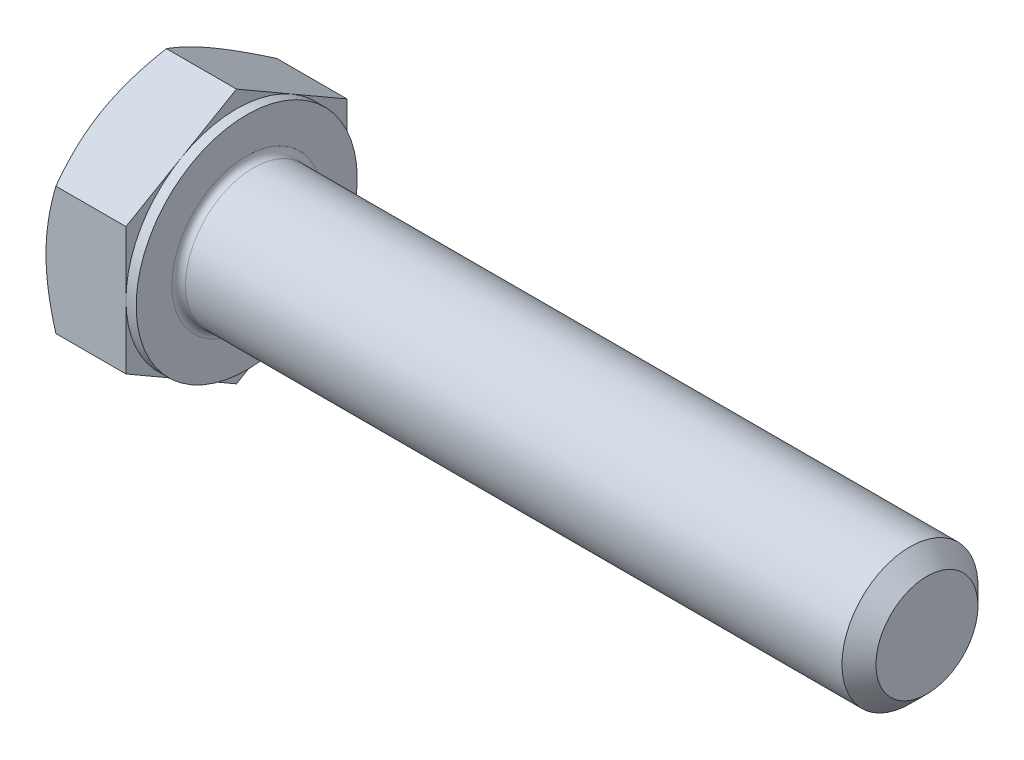
ISO-10303-21;
HEADER;
FILE_DESCRIPTION(('STEP AP214'),'2;1');
FILE_NAME('part.step','',(''),(''),'','','');
FILE_SCHEMA(('AUTOMOTIVE_DESIGN { 1 0 10303 214 1 1 1 1 }'));
ENDSEC;
DATA;
#1=APPLICATION_CONTEXT('core data for automotive mechanical design processes');
#2=APPLICATION_PROTOCOL_DEFINITION('international standard','automotive_design',2000,#1);
#3=PRODUCT_CONTEXT('',#1,'mechanical');
#4=PRODUCT('Part','Part','',(#3));
#5=PRODUCT_RELATED_PRODUCT_CATEGORY('part','',(#4));
#6=PRODUCT_DEFINITION_FORMATION('','',#4);
#7=PRODUCT_DEFINITION_CONTEXT('part definition',#1,'design');
#8=PRODUCT_DEFINITION('design','',#6,#7);
#9=PRODUCT_DEFINITION_SHAPE('','',#8);
#10=(LENGTH_UNIT() NAMED_UNIT(*) SI_UNIT(.MILLI.,.METRE.));
#11=(NAMED_UNIT(*) PLANE_ANGLE_UNIT() SI_UNIT($,.RADIAN.));
#12=(NAMED_UNIT(*) SI_UNIT($,.STERADIAN.) SOLID_ANGLE_UNIT());
#13=UNCERTAINTY_MEASURE_WITH_UNIT(LENGTH_MEASURE(1.E-05),#10,'distance_accuracy_value','');
#14=(GEOMETRIC_REPRESENTATION_CONTEXT(3) GLOBAL_UNCERTAINTY_ASSIGNED_CONTEXT((#13)) GLOBAL_UNIT_ASSIGNED_CONTEXT((#10,
#11,#12)) REPRESENTATION_CONTEXT('',''));
#15=CARTESIAN_POINT('',(0.,0.,0.));
#16=DIRECTION('',(0.,0.,1.));
#17=DIRECTION('',(1.,0.,0.));
#18=AXIS2_PLACEMENT_3D('',#15,#16,#17);
#19=CARTESIAN_POINT('',(5.3,3.75277674973256,-6.5));
#20=DIRECTION('',(0.,-0.866025403784438,0.500000000000001));
#21=DIRECTION('',(0.,-0.500000000000001,-0.866025403784438));
#22=AXIS2_PLACEMENT_3D('',#19,#20,#21);
#23=PLANE('',#22);
#24=DIRECTION('',(0.,0.500000000000001,0.866025403784438));
#25=VECTOR('',#24,1.);
#26=CARTESIAN_POINT('',(4.7,3.75277674973256,-6.5));
#27=LINE('',#26,#25);
#28=CARTESIAN_POINT('',(4.7,3.75277674973256,-6.5));
#29=VERTEX_POINT('',#28);
#30=CARTESIAN_POINT('',(4.7,5.62916512459885,-3.25));
#31=VERTEX_POINT('',#30);
#32=EDGE_CURVE('E176',#29,#31,#27,.T.);
#33=ORIENTED_EDGE('',*,*,#32,.F.);
#34=DIRECTION('',(-1.,0.,0.));
#35=VECTOR('',#34,1.);
#36=CARTESIAN_POINT('',(5.3,3.75277674973256,-6.5));
#37=LINE('',#36,#35);
#38=CARTESIAN_POINT('',(0.580556583600761,3.75277674973256,-6.5));
#39=VERTEX_POINT('',#38);
#40=EDGE_CURVE('E304',#29,#39,#37,.T.);
#41=ORIENTED_EDGE('',*,*,#40,.T.);
#42=CARTESIAN_POINT('',(0.580623251805869,7.50566896951898,0.0002));
#43=CARTESIAN_POINT('',(0.533004423075487,7.4231786300702,-0.14267745905888));
#44=CARTESIAN_POINT('',(0.487546700602708,7.34038072665458,-0.286087634534913));
#45=CARTESIAN_POINT('',(0.401548682023047,7.17411251123976,-0.574072631317195));
#46=CARTESIAN_POINT('',(0.361010507228027,7.09064192560665,-0.718647926571264));
#47=CARTESIAN_POINT('',(0.24757100112321,6.83889369625719,-1.15468865052003));
#48=CARTESIAN_POINT('',(0.183047807128741,6.66962231516081,-1.44787528284632));
#49=CARTESIAN_POINT('',(0.107386583547492,6.41631077211555,-1.88662374554437));
#50=CARTESIAN_POINT('',(0.0858328564569881,6.33302748139454,-2.03087463649469));
#51=CARTESIAN_POINT('',(0.0496903146061193,6.16608458377293,-2.32002821713809));
#52=CARTESIAN_POINT('',(0.0351008844596669,6.08242501078143,-2.46493084809889));
#53=CARTESIAN_POINT('',(0.0132587525073471,5.91496056339806,-2.75498777942832));
#54=CARTESIAN_POINT('',(0.00599772432210794,5.8311559625217,-2.90014160605421));
#55=CARTESIAN_POINT('',(-0.00103969741776869,5.66347396979287,-3.19057533697495));
#56=CARTESIAN_POINT('',(-0.000816322187795487,5.5795965802691,-3.33585523723636));
#57=CARTESIAN_POINT('',(0.010083458515165,5.34979921898453,-3.73387594242649));
#58=CARTESIAN_POINT('',(0.028381817869413,5.20395446807007,-3.98648646102757));
#59=CARTESIAN_POINT('',(0.0864063414576743,4.91323365606635,-4.49002967823568));
#60=CARTESIAN_POINT('',(0.126152338538243,4.76835861741226,-4.74096060593308));
#61=CARTESIAN_POINT('',(0.225505903202148,4.47705272008731,-5.24551722064432));
#62=CARTESIAN_POINT('',(0.285534425638025,4.33065861912702,-5.49907924143591));
#63=CARTESIAN_POINT('',(0.421774992509866,4.04005357906493,-6.00242193575904));
#64=CARTESIAN_POINT('',(0.497955034163591,3.89583891821181,-6.25220905555296));
#65=CARTESIAN_POINT('',(0.580623251805865,3.75266127967873,-6.5002));
#66=B_SPLINE_CURVE_WITH_KNOTS('',3,(#42,#43,#44,#45,#46,#47,#48,#49,#50,#51,#52,#53,#54,#55,#56,
#57,#58,#59,#60,#61,#62,#63,#64,#65),.UNSPECIFIED.,.F.,.F.,(4,2,2,2,2,2,2,2,2,2,2,4),(0.,
0.515105052395588,1.03043143507525,2.06322554824262,2.56697389547996,3.07067772176454,
3.57380860368928,4.0769239424252,4.9527935470566,5.82947446853466,6.72559912449737,
7.61996451221046),.UNSPECIFIED.);
#67=CARTESIAN_POINT('',(0.,5.62916512459885,-3.25000000000001));
#68=VERTEX_POINT('',#67);
#69=EDGE_CURVE('E231',#68,#39,#66,.T.);
#70=ORIENTED_EDGE('',*,*,#69,.F.);
#71=CARTESIAN_POINT('',(0.580556583600765,7.50555349946514,0.));
#72=VERTEX_POINT('',#71);
#73=EDGE_CURVE('E67',#72,#68,#66,.T.);
#74=ORIENTED_EDGE('',*,*,#73,.F.);
#75=DIRECTION('',(-1.,0.,0.));
#76=VECTOR('',#75,1.);
#77=CARTESIAN_POINT('',(5.3,7.50555349946514,0.));
#78=LINE('',#77,#76);
#79=CARTESIAN_POINT('',(4.7,7.50555349946514,0.));
#80=VERTEX_POINT('',#79);
#81=EDGE_CURVE('E296',#80,#72,#78,.T.);
#82=ORIENTED_EDGE('',*,*,#81,.F.);
#83=EDGE_CURVE('E174',#31,#80,#27,.T.);
#84=ORIENTED_EDGE('',*,*,#83,.F.);
#85=EDGE_LOOP('',(#33,#41,#70,#74,#82,#84));
#86=FACE_BOUND('',#85,.T.);
#87=ADVANCED_FACE('F44',(#86),#23,.F.);
#88=CARTESIAN_POINT('',(5.3,7.50555349946514,0.));
#89=DIRECTION('',(0.,-0.866025403784438,-0.500000000000001));
#90=DIRECTION('',(0.,0.500000000000001,-0.866025403784438));
#91=AXIS2_PLACEMENT_3D('',#88,#89,#90);
#92=PLANE('',#91);
#93=DIRECTION('',(0.,-0.500000000000001,0.866025403784438));
#94=VECTOR('',#93,1.);
#95=CARTESIAN_POINT('',(4.7,7.50555349946514,0.));
#96=LINE('',#95,#94);
#97=CARTESIAN_POINT('',(4.7,5.62916512459885,3.25000000000001));
#98=VERTEX_POINT('',#97);
#99=EDGE_CURVE('E173',#80,#98,#96,.T.);
#100=ORIENTED_EDGE('',*,*,#99,.F.);
#101=ORIENTED_EDGE('',*,*,#81,.T.);
#102=CARTESIAN_POINT('',(0.580623251805865,3.75266127967872,6.5002));
#103=CARTESIAN_POINT('',(0.533004423075483,3.8351516191275,6.35732254094112));
#104=CARTESIAN_POINT('',(0.487546700602704,3.91794952254312,6.21391236546509));
#105=CARTESIAN_POINT('',(0.401548682023044,4.08421773795794,5.9259273686828));
#106=CARTESIAN_POINT('',(0.361010507228023,4.16768832359105,5.78135207342873));
#107=CARTESIAN_POINT('',(0.247571001123207,4.41943655294051,5.34531134947996));
#108=CARTESIAN_POINT('',(0.183047807128738,4.58870793403689,5.05212471715368));
#109=CARTESIAN_POINT('',(0.10738658354749,4.84201947708215,4.61337625445563));
#110=CARTESIAN_POINT('',(0.0858328564569865,4.92530276780316,4.46912536350531));
#111=CARTESIAN_POINT('',(0.0496903146061183,5.09224566542477,4.17997178286191));
#112=CARTESIAN_POINT('',(0.035100884459666,5.17590523841627,4.03506915190111));
#113=CARTESIAN_POINT('',(0.0132587525073465,5.34336968579964,3.74501222057168));
#114=CARTESIAN_POINT('',(0.00599772432210779,5.427174286676,3.59985839394579));
#115=CARTESIAN_POINT('',(-0.00103969741776854,5.59485627940483,3.30942466302505));
#116=CARTESIAN_POINT('',(-0.000816322187795452,5.6787336689286,3.16414476276364));
#117=CARTESIAN_POINT('',(0.010083458515165,5.90853103021317,2.76612405757351));
#118=CARTESIAN_POINT('',(0.0283818178694132,6.05437578112763,2.51351353897243));
#119=CARTESIAN_POINT('',(0.0864063414576753,6.34509659313135,2.00997032176432));
#120=CARTESIAN_POINT('',(0.126152338538245,6.48997163178545,1.75903939406692));
#121=CARTESIAN_POINT('',(0.22550590320215,6.78127752911039,1.25448277935568));
#122=CARTESIAN_POINT('',(0.285534425638028,6.92767163007068,1.00092075856409));
#123=CARTESIAN_POINT('',(0.42177499250987,7.21827667013277,0.497578064240955));
#124=CARTESIAN_POINT('',(0.497955034163595,7.36249133098589,0.247790944447036));
#125=CARTESIAN_POINT('',(0.580623251805869,7.50566896951898,-0.000200000000000213));
#126=B_SPLINE_CURVE_WITH_KNOTS('',3,(#102,#103,#104,#105,#106,#107,#108,#109,#110,#111,#112,
#113,#114,#115,#116,#117,#118,#119,#120,#121,#122,#123,#124,#125),.UNSPECIFIED.,.F.,.F.,(4,2,2,
2,2,2,2,2,2,2,2,4),(0.,0.515105052395587,1.03043143507524,2.06322554824262,2.56697389547996,
3.07067772176454,3.57380860368928,4.0769239424252,4.9527935470566,5.82947446853466,
6.72559912449737,7.61996451221046),.UNSPECIFIED.);
#127=CARTESIAN_POINT('',(0.,5.62916512459885,3.25000000000001));
#128=VERTEX_POINT('',#127);
#129=EDGE_CURVE('E228',#128,#72,#126,.T.);
#130=ORIENTED_EDGE('',*,*,#129,.F.);
#131=CARTESIAN_POINT('',(0.58055658360076,3.75277674973256,6.5));
#132=VERTEX_POINT('',#131);
#133=EDGE_CURVE('E242',#132,#128,#126,.T.);
#134=ORIENTED_EDGE('',*,*,#133,.F.);
#135=DIRECTION('',(-1.,0.,0.));
#136=VECTOR('',#135,1.);
#137=CARTESIAN_POINT('',(5.3,3.75277674973256,6.5));
#138=LINE('',#137,#136);
#139=CARTESIAN_POINT('',(4.7,3.75277674973256,6.5));
#140=VERTEX_POINT('',#139);
#141=EDGE_CURVE('E298',#140,#132,#138,.T.);
#142=ORIENTED_EDGE('',*,*,#141,.F.);
#143=EDGE_CURVE('E141',#98,#140,#96,.T.);
#144=ORIENTED_EDGE('',*,*,#143,.F.);
#145=EDGE_LOOP('',(#100,#101,#130,#134,#142,#144));
#146=FACE_BOUND('',#145,.T.);
#147=ADVANCED_FACE('F249',(#146),#92,.F.);
#148=CARTESIAN_POINT('',(5.3,3.75277674973256,6.5));
#149=DIRECTION('',(0.,0.,-1.));
#150=DIRECTION('',(0.,1.,0.));
#151=AXIS2_PLACEMENT_3D('',#148,#149,#150);
#152=PLANE('',#151);
#153=DIRECTION('',(0.,-1.,0.));
#154=VECTOR('',#153,1.);
#155=CARTESIAN_POINT('',(4.7,3.75277674973256,6.5));
#156=LINE('',#155,#154);
#157=CARTESIAN_POINT('',(4.7,0.,6.5));
#158=VERTEX_POINT('',#157);
#159=EDGE_CURVE('E135',#140,#158,#156,.T.);
#160=ORIENTED_EDGE('',*,*,#159,.F.);
#161=ORIENTED_EDGE('',*,*,#141,.T.);
#162=CARTESIAN_POINT('',(3.18835311590246,-10.1137456678934,6.5));
#163=CARTESIAN_POINT('',(3.05034774010468,-9.82952666322138,6.5));
#164=CARTESIAN_POINT('',(2.91365616489938,-9.54465869649274,6.5));
#165=CARTESIAN_POINT('',(2.64363899497541,-8.97327978057922,6.5));
#166=CARTESIAN_POINT('',(2.51031392459097,-8.68676858388472,6.5));
#167=CARTESIAN_POINT('',(2.24710473482719,-8.11029837842689,6.5));
#168=CARTESIAN_POINT('',(2.1172430043868,-7.82032911201512,6.5));
#169=CARTESIAN_POINT('',(1.86279082826903,-7.2380954102234,6.5));
#170=CARTESIAN_POINT('',(1.73820013554674,-6.94583108317207,6.5));
#171=CARTESIAN_POINT('',(1.49176685426961,-6.34906440963036,6.5));
#172=CARTESIAN_POINT('',(1.37014257641265,-6.04447142288872,6.5));
#173=CARTESIAN_POINT('',(1.13601865758149,-5.43173420957315,6.5));
#174=CARTESIAN_POINT('',(1.02352003558022,-5.12358959079846,6.5));
#175=CARTESIAN_POINT('',(0.810575368239917,-4.5038256978226,6.5));
#176=CARTESIAN_POINT('',(0.710105232302005,-4.19221478266993,6.5));
#177=CARTESIAN_POINT('',(0.524420166144454,-3.56452019206012,6.5));
#178=CARTESIAN_POINT('',(0.439200468206418,-3.24843794792921,6.5));
#179=CARTESIAN_POINT('',(0.288524223401198,-2.61335465712783,6.5));
#180=CARTESIAN_POINT('',(0.222961865744749,-2.29437912059505,6.5));
#181=CARTESIAN_POINT('',(0.115312883130725,-1.65238219405863,6.5));
#182=CARTESIAN_POINT('',(0.0732239014690639,-1.3293612135443,6.5));
#183=CARTESIAN_POINT('',(0.0304887136381667,-0.845231171839986,6.5));
#184=CARTESIAN_POINT('',(0.0196493434273843,-0.684982209663103,6.5));
#185=CARTESIAN_POINT('',(0.00475298486143982,-0.36416234906546,6.5));
#186=CARTESIAN_POINT('',(0.000695882908832042,-0.203591456081879,6.5));
#187=CARTESIAN_POINT('',(-0.000531597190094996,0.117577430374297,6.5));
#188=CARTESIAN_POINT('',(0.00229809017012694,0.278175424090143,6.5));
#189=CARTESIAN_POINT('',(0.0147726845547639,0.599108972823505,6.5));
#190=CARTESIAN_POINT('',(0.0244179260500518,0.759444514574217,6.5));
#191=CARTESIAN_POINT('',(0.0554961939343001,1.14369946602534,6.5));
#192=CARTESIAN_POINT('',(0.0801030490514518,1.36736763045086,6.5));
#193=CARTESIAN_POINT('',(0.141246537453378,1.81305591311688,6.5));
#194=CARTESIAN_POINT('',(0.177784759614452,2.03507580783108,6.5));
#195=CARTESIAN_POINT('',(0.303360001332115,2.69839633433796,6.5));
#196=CARTESIAN_POINT('',(0.408335815147595,3.13672010374357,6.5));
#197=CARTESIAN_POINT('',(0.59056459313494,3.79232112918118,6.5));
#198=CARTESIAN_POINT('',(0.656313198979091,4.01299150874073,6.5));
#199=CARTESIAN_POINT('',(0.794681634200732,4.45218859008391,6.5));
#200=CARTESIAN_POINT('',(0.867301513122617,4.67071527639819,6.5));
#201=CARTESIAN_POINT('',(1.01824353854295,5.10569490252726,6.5));
#202=CARTESIAN_POINT('',(1.09656388232839,5.32214847365075,6.5));
#203=CARTESIAN_POINT('',(1.25798086164821,5.75325725773039,6.5));
#204=CARTESIAN_POINT('',(1.34107741035995,5.96791250329556,6.5));
#205=CARTESIAN_POINT('',(1.56029019583041,6.51888445936372,6.5));
#206=CARTESIAN_POINT('',(1.69936356666534,6.85402316813627,6.5));
#207=CARTESIAN_POINT('',(1.98501958087353,7.52109583939393,6.5));
#208=CARTESIAN_POINT('',(2.13160288780791,7.85302951559933,6.5));
#209=CARTESIAN_POINT('',(2.43059748044951,8.51437865518657,6.5));
#210=CARTESIAN_POINT('',(2.58301057596959,8.84379329784093,6.5));
#211=CARTESIAN_POINT('',(2.89234869374926,9.50047798683784,6.5));
#212=CARTESIAN_POINT('',(3.04927357220058,9.82774810112757,6.5));
#213=CARTESIAN_POINT('',(3.36692013130636,10.4809971975748,6.5));
#214=CARTESIAN_POINT('',(3.52764676491733,10.8069737667408,6.5));
#215=CARTESIAN_POINT('',(3.85198555554899,11.4574882901034,6.5));
#216=CARTESIAN_POINT('',(4.01559773123065,11.7820262349792,6.5));
#217=CARTESIAN_POINT('',(4.50986185003773,12.7537468114441,6.5));
#218=CARTESIAN_POINT('',(4.84399997978541,13.3991555932469,6.5));
#219=CARTESIAN_POINT('',(5.48575990265919,14.6239779290894,6.5));
#220=CARTESIAN_POINT('',(5.79279643372278,15.2036995760604,6.5));
#221=CARTESIAN_POINT('',(6.4106918822763,16.3611382637875,6.5));
#222=CARTESIAN_POINT('',(6.72155099010109,16.938855202873,6.5));
#223=CARTESIAN_POINT('',(7.34519775439014,18.0910273555999,6.5));
#224=CARTESIAN_POINT('',(7.65797694168864,18.665487160613,6.5));
#225=CARTESIAN_POINT('',(8.28574397153078,19.8131486204439,6.5));
#226=CARTESIAN_POINT('',(8.60073166294279,20.3863503578957,6.5));
#227=CARTESIAN_POINT('',(8.91652967168741,20.9591024521449,6.5));
#228=B_SPLINE_CURVE_WITH_KNOTS('',3,(#162,#163,#164,#165,#166,#167,#168,#169,#170,#171,#172,
#173,#174,#175,#176,#177,#178,#179,#180,#181,#182,#183,#184,#185,#186,#187,#188,#189,#190,#191,
#192,#193,#194,#195,#196,#197,#198,#199,#200,#201,#202,#203,#204,#205,#206,#207,#208,#209,#210,
#211,#212,#213,#214,#215,#216,#217,#218,#219,#220,#221,#222,#223,#224,#225,#226,#227),
.UNSPECIFIED.,.F.,.F.,(4,2,2,2,2,2,2,2,2,2,2,2,2,2,2,2,2,2,2,2,2,2,2,2,2,2,2,2,2,2,2,2,4),(0.,
0.947868666702312,1.89588406483492,2.84900320930536,3.80207763304315,4.78589774082711,
5.76982755141752,6.75175256246685,7.73337005764394,8.70960474890991,9.68574140951124,
10.1674651053568,10.6491807326436,11.1309009419855,11.6126447932157,12.287317572382,
12.9620802330383,14.312318438093,15.0030310344276,15.6937486114326,16.3842486973571,
17.0747362352244,18.1631508683747,19.2516618378194,20.3405135142583,21.4293305231019,
22.5196540547637,23.6099846401957,25.7902468235016,27.7582608872418,29.7263733429304,
31.6886408595598,33.6507753806319),.UNSPECIFIED.);
#229=CARTESIAN_POINT('',(0.,0.,6.5));
#230=VERTEX_POINT('',#229);
#231=EDGE_CURVE('E243',#230,#132,#228,.T.);
#232=ORIENTED_EDGE('',*,*,#231,.F.);
#233=CARTESIAN_POINT('',(0.580556583600765,-3.75277674973258,6.5));
#234=VERTEX_POINT('',#233);
#235=EDGE_CURVE('E305',#234,#230,#228,.T.);
#236=ORIENTED_EDGE('',*,*,#235,.F.);
#237=DIRECTION('',(-1.,0.,0.));
#238=VECTOR('',#237,1.);
#239=CARTESIAN_POINT('',(5.3,-3.75277674973258,6.5));
#240=LINE('',#239,#238);
#241=CARTESIAN_POINT('',(4.7,-3.75277674973258,6.5));
#242=VERTEX_POINT('',#241);
#243=EDGE_CURVE('E167',#242,#234,#240,.T.);
#244=ORIENTED_EDGE('',*,*,#243,.F.);
#245=EDGE_CURVE('E145',#158,#242,#156,.T.);
#246=ORIENTED_EDGE('',*,*,#245,.F.);
#247=EDGE_LOOP('',(#160,#161,#232,#236,#244,#246));
#248=FACE_BOUND('',#247,.T.);
#249=ADVANCED_FACE('F165',(#248),#152,.F.);
#250=CARTESIAN_POINT('',(5.3,-7.50555349946515,0.));
#251=DIRECTION('',(0.,0.866025403784438,-0.500000000000001));
#252=DIRECTION('',(0.,0.500000000000001,0.866025403784438));
#253=AXIS2_PLACEMENT_3D('',#250,#251,#252);
#254=PLANE('',#253);
#255=DIRECTION('',(0.,-0.500000000000001,-0.866025403784438));
#256=VECTOR('',#255,1.);
#257=CARTESIAN_POINT('',(4.7,-7.50555349946515,0.));
#258=LINE('',#257,#256);
#259=CARTESIAN_POINT('',(4.7,-5.62916512459885,3.25));
#260=VERTEX_POINT('',#259);
#261=EDGE_CURVE('E152',#242,#260,#258,.T.);
#262=ORIENTED_EDGE('',*,*,#261,.F.);
#263=ORIENTED_EDGE('',*,*,#243,.T.);
#264=CARTESIAN_POINT('',(0.580623251805877,-7.50566896951899,-0.000199999999999834));
#265=CARTESIAN_POINT('',(0.533004423075495,-7.42317863007021,0.14267745905888));
#266=CARTESIAN_POINT('',(0.487546700602716,-7.3403807266546,0.286087634534913));
#267=CARTESIAN_POINT('',(0.401548682023055,-7.17411251123977,0.574072631317195));
#268=CARTESIAN_POINT('',(0.361010507228034,-7.09064192560666,0.718647926571265));
#269=CARTESIAN_POINT('',(0.247571001123217,-6.8388936962572,1.15468865052004));
#270=CARTESIAN_POINT('',(0.183047807128748,-6.66962231516082,1.44787528284632));
#271=CARTESIAN_POINT('',(0.107386583547499,-6.41631077211556,1.88662374554438));
#272=CARTESIAN_POINT('',(0.0858328564569948,-6.33302748139455,2.03087463649469));
#273=CARTESIAN_POINT('',(0.049690314606126,-6.16608458377294,2.32002821713809));
#274=CARTESIAN_POINT('',(0.0351008844596736,-6.08242501078144,2.46493084809889));
#275=CARTESIAN_POINT('',(0.0132587525073536,-5.91496056339808,2.75498777942833));
#276=CARTESIAN_POINT('',(0.00599772432211453,-5.83115596252171,2.90014160605422));
#277=CARTESIAN_POINT('',(-0.001039697417762,-5.66347396979288,3.19057533697495));
#278=CARTESIAN_POINT('',(-0.000816322187788739,-5.57959658026911,3.33585523723636));
#279=CARTESIAN_POINT('',(0.0100834585151718,-5.34979921898454,3.7338759424265));
#280=CARTESIAN_POINT('',(0.0283818178694196,-5.20395446807008,3.98648646102758));
#281=CARTESIAN_POINT('',(0.0864063414576807,-4.91323365606637,4.49002967823568));
#282=CARTESIAN_POINT('',(0.12615233853825,-4.76835861741227,4.74096060593309));
#283=CARTESIAN_POINT('',(0.225505903202154,-4.47705272008733,5.24551722064432));
#284=CARTESIAN_POINT('',(0.28553442563803,-4.33065861912704,5.49907924143592));
#285=CARTESIAN_POINT('',(0.421774992509871,-4.04005357906495,6.00242193575905));
#286=CARTESIAN_POINT('',(0.497955034163595,-3.89583891821182,6.25220905555296));
#287=CARTESIAN_POINT('',(0.580623251805869,-3.75266127967874,6.5002));
#288=B_SPLINE_CURVE_WITH_KNOTS('',3,(#264,#265,#266,#267,#268,#269,#270,#271,#272,#273,#274,
#275,#276,#277,#278,#279,#280,#281,#282,#283,#284,#285,#286,#287),.UNSPECIFIED.,.F.,.F.,(4,2,2,
2,2,2,2,2,2,2,2,4),(0.,0.515105052395588,1.03043143507525,2.06322554824263,2.56697389547997,
3.07067772176454,3.57380860368929,4.07692394242521,4.95279354705661,5.82947446853467,
6.72559912449737,7.61996451221046),.UNSPECIFIED.);
#289=CARTESIAN_POINT('',(0.,-5.62916512459885,3.25000000000001));
#290=VERTEX_POINT('',#289);
#291=EDGE_CURVE('E230',#290,#234,#288,.T.);
#292=ORIENTED_EDGE('',*,*,#291,.F.);
#293=CARTESIAN_POINT('',(0.580556583600772,-7.50555349946515,0.));
#294=VERTEX_POINT('',#293);
#295=EDGE_CURVE('E222',#294,#290,#288,.T.);
#296=ORIENTED_EDGE('',*,*,#295,.F.);
#297=DIRECTION('',(-1.,0.,0.));
#298=VECTOR('',#297,1.);
#299=CARTESIAN_POINT('',(5.3,-7.50555349946515,0.));
#300=LINE('',#299,#298);
#301=CARTESIAN_POINT('',(4.7,-7.50555349946515,0.));
#302=VERTEX_POINT('',#301);
#303=EDGE_CURVE('E301',#302,#294,#300,.T.);
#304=ORIENTED_EDGE('',*,*,#303,.F.);
#305=EDGE_CURVE('E168',#260,#302,#258,.T.);
#306=ORIENTED_EDGE('',*,*,#305,.F.);
#307=EDGE_LOOP('',(#262,#263,#292,#296,#304,#306));
#308=FACE_BOUND('',#307,.T.);
#309=ADVANCED_FACE('F213',(#308),#254,.F.);
#310=CARTESIAN_POINT('',(5.3,-3.75277674973258,-6.5));
#311=DIRECTION('',(0.,0.866025403784438,0.500000000000001));
#312=DIRECTION('',(0.,-0.500000000000001,0.866025403784438));
#313=AXIS2_PLACEMENT_3D('',#310,#311,#312);
#314=PLANE('',#313);
#315=DIRECTION('',(0.,0.500000000000001,-0.866025403784438));
#316=VECTOR('',#315,1.);
#317=CARTESIAN_POINT('',(4.7,-3.75277674973258,-6.5));
#318=LINE('',#317,#316);
#319=CARTESIAN_POINT('',(4.7,-5.62916512459885,-3.25));
#320=VERTEX_POINT('',#319);
#321=EDGE_CURVE('E351',#302,#320,#318,.T.);
#322=ORIENTED_EDGE('',*,*,#321,.F.);
#323=ORIENTED_EDGE('',*,*,#303,.T.);
#324=CARTESIAN_POINT('',(0.580623251805869,-3.75266127967874,-6.5002));
#325=CARTESIAN_POINT('',(0.533004423075488,-3.83515161912751,-6.35732254094112));
#326=CARTESIAN_POINT('',(0.487546700602708,-3.91794952254313,-6.21391236546509));
#327=CARTESIAN_POINT('',(0.401548682023049,-4.08421773795795,-5.92592736868281));
#328=CARTESIAN_POINT('',(0.361010507228029,-4.16768832359106,-5.78135207342874));
#329=CARTESIAN_POINT('',(0.247571001123213,-4.41943655294052,-5.34531134947997));
#330=CARTESIAN_POINT('',(0.183047807128744,-4.58870793403691,-5.05212471715368));
#331=CARTESIAN_POINT('',(0.107386583547496,-4.84201947708216,-4.61337625445563));
#332=CARTESIAN_POINT('',(0.085832856456992,-4.92530276780317,-4.46912536350531));
#333=CARTESIAN_POINT('',(0.0496903146061239,-5.09224566542478,-4.17997178286191));
#334=CARTESIAN_POINT('',(0.035100884459672,-5.17590523841629,-4.03506915190111));
#335=CARTESIAN_POINT('',(0.0132587525073528,-5.34336968579965,-3.74501222057168));
#336=CARTESIAN_POINT('',(0.00599772432211393,-5.42717428667601,-3.59985839394579));
#337=CARTESIAN_POINT('',(-0.00103969741776215,-5.59485627940485,-3.30942466302505));
#338=CARTESIAN_POINT('',(-0.000816322187788696,-5.67873366892861,-3.16414476276364));
#339=CARTESIAN_POINT('',(0.0100834585151724,-5.90853103021318,-2.76612405757351));
#340=CARTESIAN_POINT('',(0.0283818178694207,-6.05437578112765,-2.51351353897243));
#341=CARTESIAN_POINT('',(0.086406341457683,-6.34509659313136,-2.00997032176432));
#342=CARTESIAN_POINT('',(0.126152338538253,-6.48997163178546,-1.75903939406692));
#343=CARTESIAN_POINT('',(0.225505903202158,-6.7812775291104,-1.25448277935568));
#344=CARTESIAN_POINT('',(0.285534425638035,-6.92767163007069,-1.00092075856409));
#345=CARTESIAN_POINT('',(0.421774992509877,-7.21827667013278,-0.497578064240955));
#346=CARTESIAN_POINT('',(0.497955034163602,-7.3624913309859,-0.247790944447036));
#347=CARTESIAN_POINT('',(0.580623251805876,-7.50566896951899,0.000199999999999993));
#348=B_SPLINE_CURVE_WITH_KNOTS('',3,(#324,#325,#326,#327,#328,#329,#330,#331,#332,#333,#334,
#335,#336,#337,#338,#339,#340,#341,#342,#343,#344,#345,#346,#347),.UNSPECIFIED.,.F.,.F.,(4,2,2,
2,2,2,2,2,2,2,2,4),(0.,0.515105052395587,1.03043143507524,2.06322554824262,2.56697389547996,
3.07067772176454,3.57380860368928,4.0769239424252,4.9527935470566,5.82947446853466,
6.72559912449736,7.61996451221046),.UNSPECIFIED.);
#349=CARTESIAN_POINT('',(0.,-5.62916512459885,-3.25));
#350=VERTEX_POINT('',#349);
#351=EDGE_CURVE('E229',#350,#294,#348,.T.);
#352=ORIENTED_EDGE('',*,*,#351,.F.);
#353=CARTESIAN_POINT('',(0.580556583600765,-3.75277674973258,-6.5));
#354=VERTEX_POINT('',#353);
#355=EDGE_CURVE('E190',#354,#350,#348,.T.);
#356=ORIENTED_EDGE('',*,*,#355,.F.);
#357=DIRECTION('',(-1.,0.,0.));
#358=VECTOR('',#357,1.);
#359=CARTESIAN_POINT('',(5.3,-3.75277674973258,-6.5));
#360=LINE('',#359,#358);
#361=CARTESIAN_POINT('',(4.7,-3.75277674973258,-6.5));
#362=VERTEX_POINT('',#361);
#363=EDGE_CURVE('E303',#362,#354,#360,.T.);
#364=ORIENTED_EDGE('',*,*,#363,.F.);
#365=EDGE_CURVE('E163',#320,#362,#318,.T.);
#366=ORIENTED_EDGE('',*,*,#365,.F.);
#367=EDGE_LOOP('',(#322,#323,#352,#356,#364,#366));
#368=FACE_BOUND('',#367,.T.);
#369=ADVANCED_FACE('F206',(#368),#314,.F.);
#370=CARTESIAN_POINT('',(5.3,3.75277674973256,-6.5));
#371=DIRECTION('',(0.,0.,1.));
#372=DIRECTION('',(0.,-1.,0.));
#373=AXIS2_PLACEMENT_3D('',#370,#371,#372);
#374=PLANE('',#373);
#375=DIRECTION('',(0.,1.,0.));
#376=VECTOR('',#375,1.);
#377=CARTESIAN_POINT('',(4.7,3.75277674973256,-6.5));
#378=LINE('',#377,#376);
#379=CARTESIAN_POINT('',(4.7,0.,-6.5));
#380=VERTEX_POINT('',#379);
#381=EDGE_CURVE('E275',#362,#380,#378,.T.);
#382=ORIENTED_EDGE('',*,*,#381,.F.);
#383=ORIENTED_EDGE('',*,*,#363,.T.);
#384=CARTESIAN_POINT('',(3.18835311590246,-10.1137456678934,-6.5));
#385=CARTESIAN_POINT('',(3.05034774010468,-9.82952666322138,-6.5));
#386=CARTESIAN_POINT('',(2.91365616489938,-9.54465869649274,-6.5));
#387=CARTESIAN_POINT('',(2.64363899497542,-8.97327978057922,-6.5));
#388=CARTESIAN_POINT('',(2.51031392459097,-8.68676858388472,-6.5));
#389=CARTESIAN_POINT('',(2.24710473482719,-8.11029837842689,-6.5));
#390=CARTESIAN_POINT('',(2.1172430043868,-7.82032911201512,-6.5));
#391=CARTESIAN_POINT('',(1.86279082826903,-7.2380954102234,-6.5));
#392=CARTESIAN_POINT('',(1.73820013554675,-6.94583108317207,-6.5));
#393=CARTESIAN_POINT('',(1.49176685426962,-6.34906440963036,-6.5));
#394=CARTESIAN_POINT('',(1.37014257641266,-6.04447142288872,-6.5));
#395=CARTESIAN_POINT('',(1.13601865758149,-5.43173420957316,-6.5));
#396=CARTESIAN_POINT('',(1.02352003558022,-5.12358959079846,-6.5));
#397=CARTESIAN_POINT('',(0.810575368239919,-4.5038256978226,-6.5));
#398=CARTESIAN_POINT('',(0.710105232302007,-4.19221478266993,-6.5));
#399=CARTESIAN_POINT('',(0.524420166144455,-3.56452019206012,-6.5));
#400=CARTESIAN_POINT('',(0.439200468206419,-3.24843794792921,-6.5));
#401=CARTESIAN_POINT('',(0.288524223401198,-2.61335465712783,-6.5));
#402=CARTESIAN_POINT('',(0.222961865744749,-2.29437912059505,-6.5));
#403=CARTESIAN_POINT('',(0.115312883130726,-1.65238219405862,-6.5));
#404=CARTESIAN_POINT('',(0.0732239014690635,-1.3293612135443,-6.5));
#405=CARTESIAN_POINT('',(0.0304887136381666,-0.845231171839984,-6.5));
#406=CARTESIAN_POINT('',(0.0196493434273846,-0.684982209663101,-6.5));
#407=CARTESIAN_POINT('',(0.0047529848614402,-0.364162349065459,-6.5));
#408=CARTESIAN_POINT('',(0.000695882908832254,-0.203591456081878,-6.5));
#409=CARTESIAN_POINT('',(-0.000531597190094705,0.117577430374298,-6.5));
#410=CARTESIAN_POINT('',(0.00229809017012751,0.278175424090144,-6.5));
#411=CARTESIAN_POINT('',(0.0147726845547647,0.599108972823507,-6.5));
#412=CARTESIAN_POINT('',(0.0244179260500526,0.759444514574219,-6.5));
#413=CARTESIAN_POINT('',(0.0554961939343006,1.14369946602534,-6.5));
#414=CARTESIAN_POINT('',(0.0801030490514521,1.36736763045086,-6.5));
#415=CARTESIAN_POINT('',(0.141246537453378,1.81305591311688,-6.5));
#416=CARTESIAN_POINT('',(0.177784759614452,2.03507580783108,-6.5));
#417=CARTESIAN_POINT('',(0.303360001332115,2.69839633433795,-6.5));
#418=CARTESIAN_POINT('',(0.408335815147594,3.13672010374357,-6.5));
#419=CARTESIAN_POINT('',(0.59056459313494,3.79232112918118,-6.5));
#420=CARTESIAN_POINT('',(0.656313198979091,4.01299150874073,-6.5));
#421=CARTESIAN_POINT('',(0.794681634200732,4.45218859008391,-6.5));
#422=CARTESIAN_POINT('',(0.867301513122617,4.67071527639819,-6.5));
#423=CARTESIAN_POINT('',(1.01824353854295,5.10569490252726,-6.5));
#424=CARTESIAN_POINT('',(1.09656388232839,5.32214847365075,-6.5));
#425=CARTESIAN_POINT('',(1.25798086164821,5.75325725773039,-6.5));
#426=CARTESIAN_POINT('',(1.34107741035995,5.96791250329556,-6.5));
#427=CARTESIAN_POINT('',(1.56029019583041,6.51888445936372,-6.5));
#428=CARTESIAN_POINT('',(1.69936356666534,6.85402316813626,-6.5));
#429=CARTESIAN_POINT('',(1.98501958087353,7.52109583939393,-6.5));
#430=CARTESIAN_POINT('',(2.13160288780791,7.85302951559933,-6.5));
#431=CARTESIAN_POINT('',(2.43059748044951,8.51437865518657,-6.5));
#432=CARTESIAN_POINT('',(2.58301057596959,8.84379329784094,-6.5));
#433=CARTESIAN_POINT('',(2.89234869374926,9.50047798683784,-6.5));
#434=CARTESIAN_POINT('',(3.04927357220059,9.82774810112757,-6.5));
#435=CARTESIAN_POINT('',(3.36692013130636,10.4809971975748,-6.5));
#436=CARTESIAN_POINT('',(3.52764676491733,10.8069737667408,-6.5));
#437=CARTESIAN_POINT('',(3.85198555554899,11.4574882901034,-6.5));
#438=CARTESIAN_POINT('',(4.01559773123066,11.7820262349792,-6.5));
#439=CARTESIAN_POINT('',(4.50986185003773,12.7537468114441,-6.5));
#440=CARTESIAN_POINT('',(4.84399997978541,13.3991555932469,-6.5));
#441=CARTESIAN_POINT('',(5.48575990265919,14.6239779290894,-6.5));
#442=CARTESIAN_POINT('',(5.79279643372279,15.2036995760604,-6.5));
#443=CARTESIAN_POINT('',(6.4106918822763,16.3611382637875,-6.5));
#444=CARTESIAN_POINT('',(6.72155099010109,16.938855202873,-6.5));
#445=CARTESIAN_POINT('',(7.34519775439015,18.0910273555999,-6.5));
#446=CARTESIAN_POINT('',(7.65797694168864,18.665487160613,-6.5));
#447=CARTESIAN_POINT('',(8.28574397153078,19.8131486204439,-6.5));
#448=CARTESIAN_POINT('',(8.60073166294279,20.3863503578957,-6.5));
#449=CARTESIAN_POINT('',(8.91652967168742,20.9591024521449,-6.49999999999999));
#450=B_SPLINE_CURVE_WITH_KNOTS('',3,(#384,#385,#386,#387,#388,#389,#390,#391,#392,#393,#394,
#395,#396,#397,#398,#399,#400,#401,#402,#403,#404,#405,#406,#407,#408,#409,#410,#411,#412,#413,
#414,#415,#416,#417,#418,#419,#420,#421,#422,#423,#424,#425,#426,#427,#428,#429,#430,#431,#432,
#433,#434,#435,#436,#437,#438,#439,#440,#441,#442,#443,#444,#445,#446,#447,#448,#449),
.UNSPECIFIED.,.F.,.F.,(4,2,2,2,2,2,2,2,2,2,2,2,2,2,2,2,2,2,2,2,2,2,2,2,2,2,2,2,2,2,2,2,4),(0.,
0.947868666702312,1.89588406483492,2.84900320930536,3.80207763304314,4.7858977408271,
5.76982755141752,6.75175256246685,7.73337005764394,8.70960474890992,9.68574140951124,
10.1674651053568,10.6491807326436,11.1309009419855,11.6126447932157,12.287317572382,
12.9620802330384,14.312318438093,15.0030310344276,15.6937486114326,16.3842486973571,
17.0747362352244,18.1631508683747,19.2516618378194,20.3405135142583,21.4293305231019,
22.5196540547637,23.6099846401957,25.7902468235017,27.7582608872418,29.7263733429304,
31.6886408595598,33.6507753806319),.UNSPECIFIED.);
#451=CARTESIAN_POINT('',(0.,0.,-6.5));
#452=VERTEX_POINT('',#451);
#453=EDGE_CURVE('E180',#452,#354,#450,.F.);
#454=ORIENTED_EDGE('',*,*,#453,.F.);
#455=EDGE_CURVE('E189',#39,#452,#450,.F.);
#456=ORIENTED_EDGE('',*,*,#455,.F.);
#457=ORIENTED_EDGE('',*,*,#40,.F.);
#458=EDGE_CURVE('E279',#380,#29,#378,.T.);
#459=ORIENTED_EDGE('',*,*,#458,.F.);
#460=EDGE_LOOP('',(#382,#383,#454,#456,#457,#459));
#461=FACE_BOUND('',#460,.T.);
#462=ADVANCED_FACE('F201',(#461),#374,.F.);
#463=CARTESIAN_POINT('',(0.,0.,0.));
#464=DIRECTION('',(1.,0.,0.));
#465=DIRECTION('',(0.,0.,-1.));
#466=AXIS2_PLACEMENT_3D('',#463,#464,#465);
#467=CONICAL_SURFACE('',#466,6.5,1.0471975511966);
#468=ORIENTED_EDGE('',*,*,#355,.T.);
#469=CARTESIAN_POINT('',(0.,0.,0.));
#470=DIRECTION('',(1.,0.,0.));
#471=DIRECTION('',(0.,0.,-1.));
#472=AXIS2_PLACEMENT_3D('',#469,#470,#471);
#473=CIRCLE('',#472,6.5);
#474=EDGE_CURVE('E292',#350,#452,#473,.T.);
#475=ORIENTED_EDGE('',*,*,#474,.T.);
#476=ORIENTED_EDGE('',*,*,#453,.T.);
#477=EDGE_LOOP('',(#468,#475,#476));
#478=FACE_BOUND('',#477,.T.);
#479=ADVANCED_FACE('F205',(#478),#467,.T.);
#480=ORIENTED_EDGE('',*,*,#295,.T.);
#481=EDGE_CURVE('E295',#290,#350,#473,.T.);
#482=ORIENTED_EDGE('',*,*,#481,.T.);
#483=ORIENTED_EDGE('',*,*,#351,.T.);
#484=EDGE_LOOP('',(#480,#482,#483));
#485=FACE_BOUND('',#484,.T.);
#486=ADVANCED_FACE('F348',(#485),#467,.T.);
#487=ORIENTED_EDGE('',*,*,#235,.T.);
#488=EDGE_CURVE('E325',#230,#290,#473,.T.);
#489=ORIENTED_EDGE('',*,*,#488,.T.);
#490=ORIENTED_EDGE('',*,*,#291,.T.);
#491=EDGE_LOOP('',(#487,#489,#490));
#492=FACE_BOUND('',#491,.T.);
#493=ADVANCED_FACE('F197',(#492),#467,.T.);
#494=ORIENTED_EDGE('',*,*,#231,.T.);
#495=ORIENTED_EDGE('',*,*,#133,.T.);
#496=CARTESIAN_POINT('',(0.,0.,0.));
#497=DIRECTION('',(-1.,0.,0.));
#498=DIRECTION('',(0.,0.,1.));
#499=AXIS2_PLACEMENT_3D('',#496,#497,#498);
#500=CIRCLE('',#499,6.5);
#501=EDGE_CURVE('E177',#230,#128,#500,.T.);
#502=ORIENTED_EDGE('',*,*,#501,.F.);
#503=EDGE_LOOP('',(#494,#495,#502));
#504=FACE_BOUND('',#503,.T.);
#505=ADVANCED_FACE('F319',(#504),#467,.T.);
#506=ORIENTED_EDGE('',*,*,#129,.T.);
#507=ORIENTED_EDGE('',*,*,#73,.T.);
#508=EDGE_CURVE('E290',#68,#128,#473,.T.);
#509=ORIENTED_EDGE('',*,*,#508,.T.);
#510=EDGE_LOOP('',(#506,#507,#509));
#511=FACE_BOUND('',#510,.T.);
#512=ADVANCED_FACE('F323',(#511),#467,.T.);
#513=ORIENTED_EDGE('',*,*,#69,.T.);
#514=ORIENTED_EDGE('',*,*,#455,.T.);
#515=EDGE_CURVE('E289',#452,#68,#473,.T.);
#516=ORIENTED_EDGE('',*,*,#515,.T.);
#517=EDGE_LOOP('',(#513,#514,#516));
#518=FACE_BOUND('',#517,.T.);
#519=ADVANCED_FACE('F339',(#518),#467,.T.);
#520=CARTESIAN_POINT('',(0.,7.50555349946514,0.));
#521=DIRECTION('',(1.,0.,0.));
#522=DIRECTION('',(0.,0.,-1.));
#523=AXIS2_PLACEMENT_3D('',#520,#521,#522);
#524=PLANE('',#523);
#525=ORIENTED_EDGE('',*,*,#515,.F.);
#526=ORIENTED_EDGE('',*,*,#474,.F.);
#527=ORIENTED_EDGE('',*,*,#481,.F.);
#528=ORIENTED_EDGE('',*,*,#488,.F.);
#529=ORIENTED_EDGE('',*,*,#501,.T.);
#530=ORIENTED_EDGE('',*,*,#508,.F.);
#531=EDGE_LOOP('',(#525,#526,#527,#528,#529,#530));
#532=FACE_BOUND('',#531,.T.);
#533=ADVANCED_FACE('F208',(#532),#524,.F.);
#534=CARTESIAN_POINT('',(4.7,6.5,0.));
#535=DIRECTION('',(1.,0.,0.));
#536=DIRECTION('',(0.,0.,-1.));
#537=AXIS2_PLACEMENT_3D('',#534,#535,#536);
#538=PLANE('',#537);
#539=ORIENTED_EDGE('',*,*,#32,.T.);
#540=CARTESIAN_POINT('',(4.7,0.,0.));
#541=DIRECTION('',(-1.,0.,0.));
#542=DIRECTION('',(0.,0.,1.));
#543=AXIS2_PLACEMENT_3D('',#540,#541,#542);
#544=CIRCLE('',#543,6.5);
#545=EDGE_CURVE('E59',#31,#380,#544,.T.);
#546=ORIENTED_EDGE('',*,*,#545,.T.);
#547=ORIENTED_EDGE('',*,*,#458,.T.);
#548=EDGE_LOOP('',(#539,#546,#547));
#549=FACE_BOUND('',#548,.T.);
#550=ADVANCED_FACE('F357',(#549),#538,.T.);
#551=ORIENTED_EDGE('',*,*,#83,.T.);
#552=ORIENTED_EDGE('',*,*,#99,.T.);
#553=EDGE_CURVE('E162',#98,#31,#544,.T.);
#554=ORIENTED_EDGE('',*,*,#553,.T.);
#555=EDGE_LOOP('',(#551,#552,#554));
#556=FACE_BOUND('',#555,.T.);
#557=ADVANCED_FACE('F359',(#556),#538,.T.);
#558=ORIENTED_EDGE('',*,*,#143,.T.);
#559=ORIENTED_EDGE('',*,*,#159,.T.);
#560=EDGE_CURVE('E139',#158,#98,#544,.T.);
#561=ORIENTED_EDGE('',*,*,#560,.T.);
#562=EDGE_LOOP('',(#558,#559,#561));
#563=FACE_BOUND('',#562,.T.);
#564=ADVANCED_FACE('F137',(#563),#538,.T.);
#565=ORIENTED_EDGE('',*,*,#245,.T.);
#566=ORIENTED_EDGE('',*,*,#261,.T.);
#567=EDGE_CURVE('E149',#260,#158,#544,.T.);
#568=ORIENTED_EDGE('',*,*,#567,.T.);
#569=EDGE_LOOP('',(#565,#566,#568));
#570=FACE_BOUND('',#569,.T.);
#571=ADVANCED_FACE('F150',(#570),#538,.T.);
#572=ORIENTED_EDGE('',*,*,#305,.T.);
#573=ORIENTED_EDGE('',*,*,#321,.T.);
#574=EDGE_CURVE('E156',#320,#260,#544,.T.);
#575=ORIENTED_EDGE('',*,*,#574,.T.);
#576=EDGE_LOOP('',(#572,#573,#575));
#577=FACE_BOUND('',#576,.T.);
#578=ADVANCED_FACE('F373',(#577),#538,.T.);
#579=ORIENTED_EDGE('',*,*,#365,.T.);
#580=ORIENTED_EDGE('',*,*,#381,.T.);
#581=EDGE_CURVE('E356',#380,#320,#544,.T.);
#582=ORIENTED_EDGE('',*,*,#581,.T.);
#583=EDGE_LOOP('',(#579,#580,#582));
#584=FACE_BOUND('',#583,.T.);
#585=ADVANCED_FACE('F354',(#584),#538,.T.);
#586=CARTESIAN_POINT('',(0.,0.,0.));
#587=DIRECTION('',(-1.,0.,0.));
#588=DIRECTION('',(0.,0.,1.));
#589=AXIS2_PLACEMENT_3D('',#586,#587,#588);
#590=CYLINDRICAL_SURFACE('',#589,6.5);
#591=ORIENTED_EDGE('',*,*,#545,.F.);
#592=ORIENTED_EDGE('',*,*,#553,.F.);
#593=ORIENTED_EDGE('',*,*,#560,.F.);
#594=ORIENTED_EDGE('',*,*,#567,.F.);
#595=ORIENTED_EDGE('',*,*,#574,.F.);
#596=ORIENTED_EDGE('',*,*,#581,.F.);
#597=EDGE_LOOP('',(#591,#592,#593,#594,#595,#596));
#598=FACE_BOUND('',#597,.T.);
#599=CARTESIAN_POINT('',(5.3,0.,0.));
#600=DIRECTION('',(1.,0.,0.));
#601=DIRECTION('',(0.,0.,-1.));
#602=AXIS2_PLACEMENT_3D('',#599,#600,#601);
#603=CIRCLE('',#602,6.5);
#604=CARTESIAN_POINT('',(5.3,0.,-6.5));
#605=VERTEX_POINT('',#604);
#606=EDGE_CURVE('E288',#605,#605,#603,.T.);
#607=ORIENTED_EDGE('',*,*,#606,.F.);
#608=EDGE_LOOP('',(#607));
#609=FACE_BOUND('',#608,.T.);
#610=ADVANCED_FACE('F159',(#598,#609),#590,.T.);
#611=CARTESIAN_POINT('',(45.3,0.,0.));
#612=DIRECTION('',(-1.,0.,0.));
#613=DIRECTION('',(0.,0.,1.));
#614=AXIS2_PLACEMENT_3D('',#611,#612,#613);
#615=PLANE('',#614);
#616=CARTESIAN_POINT('',(45.3,0.,0.));
#617=DIRECTION('',(-1.,0.,0.));
#618=DIRECTION('',(0.,0.,1.));
#619=AXIS2_PLACEMENT_3D('',#616,#617,#618);
#620=CIRCLE('',#619,2.99999999999999);
#621=CARTESIAN_POINT('',(45.3,0.,2.99999999999999));
#622=VERTEX_POINT('',#621);
#623=EDGE_CURVE('E270',#622,#622,#620,.F.);
#624=ORIENTED_EDGE('',*,*,#623,.T.);
#625=EDGE_LOOP('',(#624));
#626=FACE_BOUND('',#625,.T.);
#627=ADVANCED_FACE('F367',(#626),#615,.F.);
#628=CARTESIAN_POINT('',(0.,0.,0.));
#629=DIRECTION('',(-1.,0.,0.));
#630=DIRECTION('',(0.,0.,1.));
#631=AXIS2_PLACEMENT_3D('',#628,#629,#630);
#632=CYLINDRICAL_SURFACE('',#631,4.);
#633=CARTESIAN_POINT('',(5.7,0.,0.));
#634=DIRECTION('',(1.,0.,0.));
#635=DIRECTION('',(0.,0.,-1.));
#636=AXIS2_PLACEMENT_3D('',#633,#634,#635);
#637=CIRCLE('',#636,4.);
#638=CARTESIAN_POINT('',(5.7,0.,-4.));
#639=VERTEX_POINT('',#638);
#640=EDGE_CURVE('E12',#639,#639,#637,.T.);
#641=ORIENTED_EDGE('',*,*,#640,.T.);
#642=EDGE_LOOP('',(#641));
#643=FACE_BOUND('',#642,.T.);
#644=CARTESIAN_POINT('',(44.3,0.,0.));
#645=DIRECTION('',(-1.,0.,0.));
#646=DIRECTION('',(0.,0.,1.));
#647=AXIS2_PLACEMENT_3D('',#644,#645,#646);
#648=CIRCLE('',#647,4.);
#649=CARTESIAN_POINT('',(44.3,0.,4.));
#650=VERTEX_POINT('',#649);
#651=EDGE_CURVE('E273',#650,#650,#648,.T.);
#652=ORIENTED_EDGE('',*,*,#651,.T.);
#653=EDGE_LOOP('',(#652));
#654=FACE_BOUND('',#653,.T.);
#655=ADVANCED_FACE('F265',(#643,#654),#632,.T.);
#656=CARTESIAN_POINT('',(5.3,7.50555349946514,0.));
#657=DIRECTION('',(1.,0.,0.));
#658=DIRECTION('',(0.,0.,-1.));
#659=AXIS2_PLACEMENT_3D('',#656,#657,#658);
#660=PLANE('',#659);
#661=CARTESIAN_POINT('',(5.3,0.,0.));
#662=DIRECTION('',(1.,0.,0.));
#663=DIRECTION('',(0.,0.,-1.));
#664=AXIS2_PLACEMENT_3D('',#661,#662,#663);
#665=CIRCLE('',#664,4.4);
#666=CARTESIAN_POINT('',(5.3,0.,-4.4));
#667=VERTEX_POINT('',#666);
#668=EDGE_CURVE('E52',#667,#667,#665,.F.);
#669=ORIENTED_EDGE('',*,*,#668,.T.);
#670=EDGE_LOOP('',(#669));
#671=FACE_BOUND('',#670,.T.);
#672=ORIENTED_EDGE('',*,*,#606,.T.);
#673=EDGE_LOOP('',(#672));
#674=FACE_BOUND('',#673,.T.);
#675=ADVANCED_FACE('F258',(#671,#674),#660,.T.);
#676=CARTESIAN_POINT('',(44.3,0.,0.));
#677=DIRECTION('',(-1.,0.,0.));
#678=DIRECTION('',(0.,0.,1.));
#679=AXIS2_PLACEMENT_3D('',#676,#677,#678);
#680=CONICAL_SURFACE('',#679,4.,0.785398163397456);
#681=ORIENTED_EDGE('',*,*,#623,.F.);
#682=EDGE_LOOP('',(#681));
#683=FACE_BOUND('',#682,.T.);
#684=ORIENTED_EDGE('',*,*,#651,.F.);
#685=EDGE_LOOP('',(#684));
#686=FACE_BOUND('',#685,.T.);
#687=ADVANCED_FACE('F256',(#683,#686),#680,.T.);
#688=CARTESIAN_POINT('',(5.7,0.,0.));
#689=DIRECTION('',(1.,0.,0.));
#690=DIRECTION('',(0.,0.,-1.));
#691=AXIS2_PLACEMENT_3D('',#688,#689,#690);
#692=TOROIDAL_SURFACE('',#691,4.4,0.4);
#693=ORIENTED_EDGE('',*,*,#640,.F.);
#694=EDGE_LOOP('',(#693));
#695=FACE_BOUND('',#694,.T.);
#696=ORIENTED_EDGE('',*,*,#668,.F.);
#697=EDGE_LOOP('',(#696));
#698=FACE_BOUND('',#697,.T.);
#699=ADVANCED_FACE('F46',(#695,#698),#692,.F.);
#700=CLOSED_SHELL('',(#87,#147,#249,#309,#369,#462,#479,#486,#493,#505,#512,#519,#533,#550,#557,
#564,#571,#578,#585,#610,#627,#655,#675,#687,#699));
#701=MANIFOLD_SOLID_BREP('B2',#700);
#702=ADVANCED_BREP_SHAPE_REPRESENTATION('',(#18,#701),#14);
#703=SHAPE_DEFINITION_REPRESENTATION(#9,#702);
ENDSEC;
END-ISO-10303-21;
